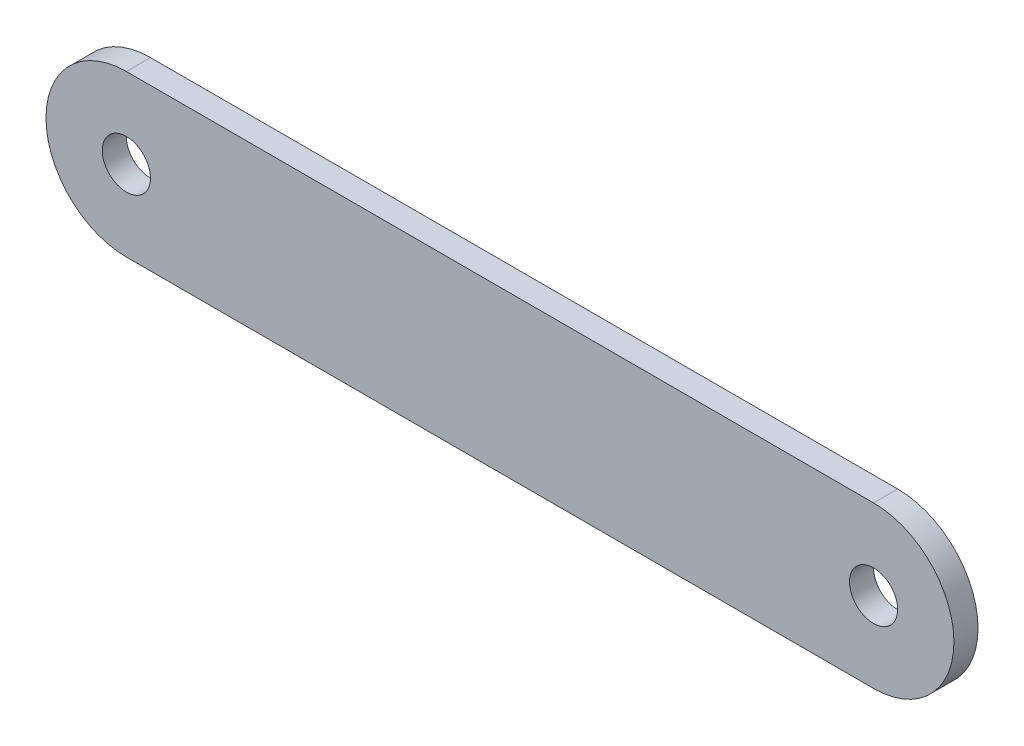
ISO-10303-21;
HEADER;
FILE_DESCRIPTION(('STEP AP214'),'2;1');
FILE_NAME('part.step','',(''),(''),'','','');
FILE_SCHEMA(('AUTOMOTIVE_DESIGN { 1 0 10303 214 1 1 1 1 }'));
ENDSEC;
DATA;
#1=APPLICATION_CONTEXT('core data for automotive mechanical design processes');
#2=APPLICATION_PROTOCOL_DEFINITION('international standard','automotive_design',2000,#1);
#3=PRODUCT_CONTEXT('',#1,'mechanical');
#4=PRODUCT('Part','Part','',(#3));
#5=PRODUCT_RELATED_PRODUCT_CATEGORY('part','',(#4));
#6=PRODUCT_DEFINITION_FORMATION('','',#4);
#7=PRODUCT_DEFINITION_CONTEXT('part definition',#1,'design');
#8=PRODUCT_DEFINITION('design','',#6,#7);
#9=PRODUCT_DEFINITION_SHAPE('','',#8);
#10=(LENGTH_UNIT() NAMED_UNIT(*) SI_UNIT(.MILLI.,.METRE.));
#11=(NAMED_UNIT(*) PLANE_ANGLE_UNIT() SI_UNIT($,.RADIAN.));
#12=(NAMED_UNIT(*) SI_UNIT($,.STERADIAN.) SOLID_ANGLE_UNIT());
#13=UNCERTAINTY_MEASURE_WITH_UNIT(LENGTH_MEASURE(1.E-05),#10,'distance_accuracy_value','');
#14=(GEOMETRIC_REPRESENTATION_CONTEXT(3) GLOBAL_UNCERTAINTY_ASSIGNED_CONTEXT((#13)) GLOBAL_UNIT_ASSIGNED_CONTEXT((#10,
#11,#12)) REPRESENTATION_CONTEXT('',''));
#15=CARTESIAN_POINT('',(0.,0.,0.));
#16=DIRECTION('',(0.,0.,1.));
#17=DIRECTION('',(1.,0.,0.));
#18=AXIS2_PLACEMENT_3D('',#15,#16,#17);
#19=CARTESIAN_POINT('',(0.,0.,1.5));
#20=DIRECTION('',(0.,0.,-1.));
#21=DIRECTION('',(-1.,0.,0.));
#22=AXIS2_PLACEMENT_3D('',#19,#20,#21);
#23=PLANE('',#22);
#24=CARTESIAN_POINT('',(0.,0.,1.5));
#25=DIRECTION('',(0.,0.,1.));
#26=DIRECTION('',(-1.,0.,0.));
#27=AXIS2_PLACEMENT_3D('',#24,#25,#26);
#28=CIRCLE('',#27,5.);
#29=CARTESIAN_POINT('',(0.,5.,1.5));
#30=VERTEX_POINT('',#29);
#31=CARTESIAN_POINT('',(0.,-5.,1.5));
#32=VERTEX_POINT('',#31);
#33=EDGE_CURVE('E85',#30,#32,#28,.T.);
#34=ORIENTED_EDGE('',*,*,#33,.T.);
#35=DIRECTION('',(1.,0.,0.));
#36=VECTOR('',#35,1.);
#37=CARTESIAN_POINT('',(46.5,-5.,1.5));
#38=LINE('',#37,#36);
#39=CARTESIAN_POINT('',(46.5,-5.,1.5));
#40=VERTEX_POINT('',#39);
#41=EDGE_CURVE('E80',#32,#40,#38,.T.);
#42=ORIENTED_EDGE('',*,*,#41,.T.);
#43=CARTESIAN_POINT('',(46.5,0.,1.5));
#44=DIRECTION('',(0.,0.,1.));
#45=DIRECTION('',(-1.,0.,0.));
#46=AXIS2_PLACEMENT_3D('',#43,#44,#45);
#47=CIRCLE('',#46,5.);
#48=CARTESIAN_POINT('',(46.5,5.,1.5));
#49=VERTEX_POINT('',#48);
#50=EDGE_CURVE('E83',#40,#49,#47,.T.);
#51=ORIENTED_EDGE('',*,*,#50,.T.);
#52=DIRECTION('',(-1.,0.,0.));
#53=VECTOR('',#52,1.);
#54=CARTESIAN_POINT('',(0.,5.,1.5));
#55=LINE('',#54,#53);
#56=EDGE_CURVE('E50',#49,#30,#55,.T.);
#57=ORIENTED_EDGE('',*,*,#56,.T.);
#58=EDGE_LOOP('',(#34,#42,#51,#57));
#59=FACE_BOUND('',#58,.T.);
#60=CARTESIAN_POINT('',(0.,0.,1.5));
#61=DIRECTION('',(0.,0.,1.));
#62=DIRECTION('',(1.,0.,0.));
#63=AXIS2_PLACEMENT_3D('',#60,#61,#62);
#64=CIRCLE('',#63,1.5);
#65=CARTESIAN_POINT('',(1.5,0.,1.5));
#66=VERTEX_POINT('',#65);
#67=EDGE_CURVE('E100',#66,#66,#64,.T.);
#68=ORIENTED_EDGE('',*,*,#67,.F.);
#69=EDGE_LOOP('',(#68));
#70=FACE_BOUND('',#69,.T.);
#71=CARTESIAN_POINT('',(46.5,0.,1.5));
#72=DIRECTION('',(0.,0.,1.));
#73=DIRECTION('',(1.,0.,0.));
#74=AXIS2_PLACEMENT_3D('',#71,#72,#73);
#75=CIRCLE('',#74,1.5);
#76=CARTESIAN_POINT('',(48.,0.,1.5));
#77=VERTEX_POINT('',#76);
#78=EDGE_CURVE('E115',#77,#77,#75,.T.);
#79=ORIENTED_EDGE('',*,*,#78,.F.);
#80=EDGE_LOOP('',(#79));
#81=FACE_BOUND('',#80,.T.);
#82=ADVANCED_FACE('F33',(#59,#70,#81),#23,.F.);
#83=CARTESIAN_POINT('',(0.,0.,0.));
#84=DIRECTION('',(0.,0.,-1.));
#85=DIRECTION('',(-1.,0.,0.));
#86=AXIS2_PLACEMENT_3D('',#83,#84,#85);
#87=PLANE('',#86);
#88=CARTESIAN_POINT('',(0.,0.,0.));
#89=DIRECTION('',(0.,0.,1.));
#90=DIRECTION('',(1.,0.,0.));
#91=AXIS2_PLACEMENT_3D('',#88,#89,#90);
#92=CIRCLE('',#91,1.5);
#93=CARTESIAN_POINT('',(1.5,0.,0.));
#94=VERTEX_POINT('',#93);
#95=EDGE_CURVE('E112',#94,#94,#92,.T.);
#96=ORIENTED_EDGE('',*,*,#95,.T.);
#97=EDGE_LOOP('',(#96));
#98=FACE_BOUND('',#97,.T.);
#99=CARTESIAN_POINT('',(0.,0.,0.));
#100=DIRECTION('',(0.,0.,1.));
#101=DIRECTION('',(-1.,0.,0.));
#102=AXIS2_PLACEMENT_3D('',#99,#100,#101);
#103=CIRCLE('',#102,5.);
#104=CARTESIAN_POINT('',(0.,5.,0.));
#105=VERTEX_POINT('',#104);
#106=CARTESIAN_POINT('',(0.,-5.,0.));
#107=VERTEX_POINT('',#106);
#108=EDGE_CURVE('E97',#105,#107,#103,.T.);
#109=ORIENTED_EDGE('',*,*,#108,.F.);
#110=DIRECTION('',(-1.,0.,0.));
#111=VECTOR('',#110,1.);
#112=CARTESIAN_POINT('',(0.,5.,0.));
#113=LINE('',#112,#111);
#114=CARTESIAN_POINT('',(46.5,5.,0.));
#115=VERTEX_POINT('',#114);
#116=EDGE_CURVE('E73',#115,#105,#113,.T.);
#117=ORIENTED_EDGE('',*,*,#116,.F.);
#118=CARTESIAN_POINT('',(46.5,0.,0.));
#119=DIRECTION('',(0.,0.,1.));
#120=DIRECTION('',(-1.,0.,0.));
#121=AXIS2_PLACEMENT_3D('',#118,#119,#120);
#122=CIRCLE('',#121,5.);
#123=CARTESIAN_POINT('',(46.5,-5.,0.));
#124=VERTEX_POINT('',#123);
#125=EDGE_CURVE('E67',#124,#115,#122,.T.);
#126=ORIENTED_EDGE('',*,*,#125,.F.);
#127=DIRECTION('',(1.,0.,0.));
#128=VECTOR('',#127,1.);
#129=CARTESIAN_POINT('',(46.5,-5.,0.));
#130=LINE('',#129,#128);
#131=EDGE_CURVE('E89',#107,#124,#130,.T.);
#132=ORIENTED_EDGE('',*,*,#131,.F.);
#133=EDGE_LOOP('',(#109,#117,#126,#132));
#134=FACE_BOUND('',#133,.T.);
#135=CARTESIAN_POINT('',(46.5,0.,0.));
#136=DIRECTION('',(0.,0.,1.));
#137=DIRECTION('',(1.,0.,0.));
#138=AXIS2_PLACEMENT_3D('',#135,#136,#137);
#139=CIRCLE('',#138,1.5);
#140=CARTESIAN_POINT('',(48.,0.,0.));
#141=VERTEX_POINT('',#140);
#142=EDGE_CURVE('E118',#141,#141,#139,.T.);
#143=ORIENTED_EDGE('',*,*,#142,.T.);
#144=EDGE_LOOP('',(#143));
#145=FACE_BOUND('',#144,.T.);
#146=ADVANCED_FACE('F108',(#98,#134,#145),#87,.T.);
#147=CARTESIAN_POINT('',(0.,0.,1.5));
#148=DIRECTION('',(0.,0.,-1.));
#149=DIRECTION('',(-1.,0.,0.));
#150=AXIS2_PLACEMENT_3D('',#147,#148,#149);
#151=CYLINDRICAL_SURFACE('',#150,5.);
#152=ORIENTED_EDGE('',*,*,#108,.T.);
#153=DIRECTION('',(0.,0.,-1.));
#154=VECTOR('',#153,1.);
#155=CARTESIAN_POINT('',(0.,-5.,1.5));
#156=LINE('',#155,#154);
#157=EDGE_CURVE('E11',#32,#107,#156,.T.);
#158=ORIENTED_EDGE('',*,*,#157,.F.);
#159=ORIENTED_EDGE('',*,*,#33,.F.);
#160=DIRECTION('',(0.,0.,-1.));
#161=VECTOR('',#160,1.);
#162=CARTESIAN_POINT('',(0.,5.,1.5));
#163=LINE('',#162,#161);
#164=EDGE_CURVE('E93',#30,#105,#163,.T.);
#165=ORIENTED_EDGE('',*,*,#164,.T.);
#166=EDGE_LOOP('',(#152,#158,#159,#165));
#167=FACE_BOUND('',#166,.T.);
#168=ADVANCED_FACE('F35',(#167),#151,.T.);
#169=CARTESIAN_POINT('',(46.5,-5.,1.5));
#170=DIRECTION('',(0.,1.,0.));
#171=DIRECTION('',(-1.,0.,0.));
#172=AXIS2_PLACEMENT_3D('',#169,#170,#171);
#173=PLANE('',#172);
#174=ORIENTED_EDGE('',*,*,#131,.T.);
#175=DIRECTION('',(0.,0.,-1.));
#176=VECTOR('',#175,1.);
#177=CARTESIAN_POINT('',(46.5,-5.,1.5));
#178=LINE('',#177,#176);
#179=EDGE_CURVE('E42',#40,#124,#178,.T.);
#180=ORIENTED_EDGE('',*,*,#179,.F.);
#181=ORIENTED_EDGE('',*,*,#41,.F.);
#182=ORIENTED_EDGE('',*,*,#157,.T.);
#183=EDGE_LOOP('',(#174,#180,#181,#182));
#184=FACE_BOUND('',#183,.T.);
#185=ADVANCED_FACE('F88',(#184),#173,.F.);
#186=CARTESIAN_POINT('',(46.5,0.,1.5));
#187=DIRECTION('',(0.,0.,-1.));
#188=DIRECTION('',(-1.,0.,0.));
#189=AXIS2_PLACEMENT_3D('',#186,#187,#188);
#190=CYLINDRICAL_SURFACE('',#189,5.);
#191=ORIENTED_EDGE('',*,*,#125,.T.);
#192=DIRECTION('',(0.,0.,-1.));
#193=VECTOR('',#192,1.);
#194=CARTESIAN_POINT('',(46.5,5.,1.5));
#195=LINE('',#194,#193);
#196=EDGE_CURVE('E90',#49,#115,#195,.T.);
#197=ORIENTED_EDGE('',*,*,#196,.F.);
#198=ORIENTED_EDGE('',*,*,#50,.F.);
#199=ORIENTED_EDGE('',*,*,#179,.T.);
#200=EDGE_LOOP('',(#191,#197,#198,#199));
#201=FACE_BOUND('',#200,.T.);
#202=ADVANCED_FACE('F91',(#201),#190,.T.);
#203=CARTESIAN_POINT('',(0.,5.,1.5));
#204=DIRECTION('',(0.,-1.,0.));
#205=DIRECTION('',(0.,0.,-1.));
#206=AXIS2_PLACEMENT_3D('',#203,#204,#205);
#207=PLANE('',#206);
#208=ORIENTED_EDGE('',*,*,#116,.T.);
#209=ORIENTED_EDGE('',*,*,#164,.F.);
#210=ORIENTED_EDGE('',*,*,#56,.F.);
#211=ORIENTED_EDGE('',*,*,#196,.T.);
#212=EDGE_LOOP('',(#208,#209,#210,#211));
#213=FACE_BOUND('',#212,.T.);
#214=ADVANCED_FACE('F105',(#213),#207,.F.);
#215=CARTESIAN_POINT('',(0.,0.,1.5));
#216=DIRECTION('',(0.,0.,-1.));
#217=DIRECTION('',(-1.,0.,0.));
#218=AXIS2_PLACEMENT_3D('',#215,#216,#217);
#219=CYLINDRICAL_SURFACE('',#218,1.5);
#220=ORIENTED_EDGE('',*,*,#67,.T.);
#221=EDGE_LOOP('',(#220));
#222=FACE_BOUND('',#221,.T.);
#223=ORIENTED_EDGE('',*,*,#95,.F.);
#224=EDGE_LOOP('',(#223));
#225=FACE_BOUND('',#224,.T.);
#226=ADVANCED_FACE('F135',(#222,#225),#219,.F.);
#227=CARTESIAN_POINT('',(46.5,0.,1.5));
#228=DIRECTION('',(0.,0.,-1.));
#229=DIRECTION('',(-1.,0.,0.));
#230=AXIS2_PLACEMENT_3D('',#227,#228,#229);
#231=CYLINDRICAL_SURFACE('',#230,1.5);
#232=ORIENTED_EDGE('',*,*,#78,.T.);
#233=EDGE_LOOP('',(#232));
#234=FACE_BOUND('',#233,.T.);
#235=ORIENTED_EDGE('',*,*,#142,.F.);
#236=EDGE_LOOP('',(#235));
#237=FACE_BOUND('',#236,.T.);
#238=ADVANCED_FACE('F124',(#234,#237),#231,.F.);
#239=CLOSED_SHELL('',(#82,#146,#168,#185,#202,#214,#226,#238));
#240=MANIFOLD_SOLID_BREP('B2',#239);
#241=ADVANCED_BREP_SHAPE_REPRESENTATION('',(#18,#240),#14);
#242=SHAPE_DEFINITION_REPRESENTATION(#9,#241);
ENDSEC;
END-ISO-10303-21;
